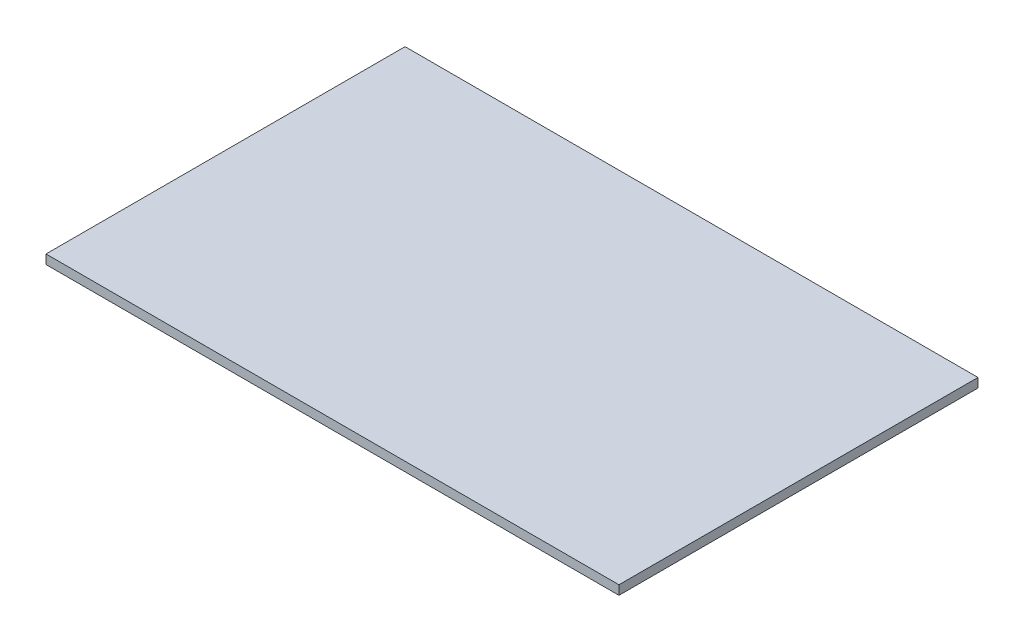
ISO-10303-21;
HEADER;
FILE_DESCRIPTION(('STEP AP214'),'2;1');
FILE_NAME('part.step','',(''),(''),'','','');
FILE_SCHEMA(('AUTOMOTIVE_DESIGN { 1 0 10303 214 1 1 1 1 }'));
ENDSEC;
DATA;
#1=APPLICATION_CONTEXT('core data for automotive mechanical design processes');
#2=APPLICATION_PROTOCOL_DEFINITION('international standard','automotive_design',2000,#1);
#3=PRODUCT_CONTEXT('',#1,'mechanical');
#4=PRODUCT('Part','Part','',(#3));
#5=PRODUCT_RELATED_PRODUCT_CATEGORY('part','',(#4));
#6=PRODUCT_DEFINITION_FORMATION('','',#4);
#7=PRODUCT_DEFINITION_CONTEXT('part definition',#1,'design');
#8=PRODUCT_DEFINITION('design','',#6,#7);
#9=PRODUCT_DEFINITION_SHAPE('','',#8);
#10=(LENGTH_UNIT() NAMED_UNIT(*) SI_UNIT(.MILLI.,.METRE.));
#11=(NAMED_UNIT(*) PLANE_ANGLE_UNIT() SI_UNIT($,.RADIAN.));
#12=(NAMED_UNIT(*) SI_UNIT($,.STERADIAN.) SOLID_ANGLE_UNIT());
#13=UNCERTAINTY_MEASURE_WITH_UNIT(LENGTH_MEASURE(1.E-05),#10,'distance_accuracy_value','');
#14=(GEOMETRIC_REPRESENTATION_CONTEXT(3) GLOBAL_UNCERTAINTY_ASSIGNED_CONTEXT((#13)) GLOBAL_UNIT_ASSIGNED_CONTEXT((#10,
#11,#12)) REPRESENTATION_CONTEXT('',''));
#15=CARTESIAN_POINT('',(0.,0.,0.));
#16=DIRECTION('',(0.,0.,1.));
#17=DIRECTION('',(1.,0.,0.));
#18=AXIS2_PLACEMENT_3D('',#15,#16,#17);
#19=CARTESIAN_POINT('',(375.,12.,235.));
#20=DIRECTION('',(-1.,0.,0.));
#21=DIRECTION('',(0.,0.,1.));
#22=AXIS2_PLACEMENT_3D('',#19,#20,#21);
#23=PLANE('',#22);
#24=DIRECTION('',(0.,0.,-1.));
#25=VECTOR('',#24,1.);
#26=CARTESIAN_POINT('',(375.,0.,235.));
#27=LINE('',#26,#25);
#28=CARTESIAN_POINT('',(375.,0.,235.));
#29=VERTEX_POINT('',#28);
#30=CARTESIAN_POINT('',(375.,0.,-235.));
#31=VERTEX_POINT('',#30);
#32=EDGE_CURVE('E96',#29,#31,#27,.T.);
#33=ORIENTED_EDGE('',*,*,#32,.T.);
#34=DIRECTION('',(0.,-1.,0.));
#35=VECTOR('',#34,1.);
#36=CARTESIAN_POINT('',(375.,12.,-235.));
#37=LINE('',#36,#35);
#38=CARTESIAN_POINT('',(375.,12.,-235.));
#39=VERTEX_POINT('',#38);
#40=EDGE_CURVE('E11',#39,#31,#37,.T.);
#41=ORIENTED_EDGE('',*,*,#40,.F.);
#42=DIRECTION('',(0.,0.,-1.));
#43=VECTOR('',#42,1.);
#44=CARTESIAN_POINT('',(375.,12.,235.));
#45=LINE('',#44,#43);
#46=CARTESIAN_POINT('',(375.,12.,235.));
#47=VERTEX_POINT('',#46);
#48=EDGE_CURVE('E84',#47,#39,#45,.T.);
#49=ORIENTED_EDGE('',*,*,#48,.F.);
#50=DIRECTION('',(0.,-1.,0.));
#51=VECTOR('',#50,1.);
#52=CARTESIAN_POINT('',(375.,12.,235.));
#53=LINE('',#52,#51);
#54=EDGE_CURVE('E92',#47,#29,#53,.T.);
#55=ORIENTED_EDGE('',*,*,#54,.T.);
#56=EDGE_LOOP('',(#33,#41,#49,#55));
#57=FACE_BOUND('',#56,.T.);
#58=ADVANCED_FACE('F33',(#57),#23,.F.);
#59=CARTESIAN_POINT('',(-375.,12.,-235.));
#60=DIRECTION('',(0.,0.,1.));
#61=DIRECTION('',(1.,0.,0.));
#62=AXIS2_PLACEMENT_3D('',#59,#60,#61);
#63=PLANE('',#62);
#64=DIRECTION('',(-1.,0.,0.));
#65=VECTOR('',#64,1.);
#66=CARTESIAN_POINT('',(-375.,0.,-235.));
#67=LINE('',#66,#65);
#68=CARTESIAN_POINT('',(-375.,0.,-235.));
#69=VERTEX_POINT('',#68);
#70=EDGE_CURVE('E88',#31,#69,#67,.T.);
#71=ORIENTED_EDGE('',*,*,#70,.T.);
#72=DIRECTION('',(0.,-1.,0.));
#73=VECTOR('',#72,1.);
#74=CARTESIAN_POINT('',(-375.,12.,-235.));
#75=LINE('',#74,#73);
#76=CARTESIAN_POINT('',(-375.,12.,-235.));
#77=VERTEX_POINT('',#76);
#78=EDGE_CURVE('E41',#77,#69,#75,.T.);
#79=ORIENTED_EDGE('',*,*,#78,.F.);
#80=DIRECTION('',(-1.,0.,0.));
#81=VECTOR('',#80,1.);
#82=CARTESIAN_POINT('',(-375.,12.,-235.));
#83=LINE('',#82,#81);
#84=EDGE_CURVE('E79',#39,#77,#83,.T.);
#85=ORIENTED_EDGE('',*,*,#84,.F.);
#86=ORIENTED_EDGE('',*,*,#40,.T.);
#87=EDGE_LOOP('',(#71,#79,#85,#86));
#88=FACE_BOUND('',#87,.T.);
#89=ADVANCED_FACE('F87',(#88),#63,.F.);
#90=CARTESIAN_POINT('',(-375.,12.,235.));
#91=DIRECTION('',(1.,0.,0.));
#92=DIRECTION('',(0.,0.,-1.));
#93=AXIS2_PLACEMENT_3D('',#90,#91,#92);
#94=PLANE('',#93);
#95=DIRECTION('',(0.,0.,1.));
#96=VECTOR('',#95,1.);
#97=CARTESIAN_POINT('',(-375.,0.,235.));
#98=LINE('',#97,#96);
#99=CARTESIAN_POINT('',(-375.,0.,235.));
#100=VERTEX_POINT('',#99);
#101=EDGE_CURVE('E66',#69,#100,#98,.T.);
#102=ORIENTED_EDGE('',*,*,#101,.T.);
#103=DIRECTION('',(0.,-1.,0.));
#104=VECTOR('',#103,1.);
#105=CARTESIAN_POINT('',(-375.,12.,235.));
#106=LINE('',#105,#104);
#107=CARTESIAN_POINT('',(-375.,12.,235.));
#108=VERTEX_POINT('',#107);
#109=EDGE_CURVE('E89',#108,#100,#106,.T.);
#110=ORIENTED_EDGE('',*,*,#109,.F.);
#111=DIRECTION('',(0.,0.,1.));
#112=VECTOR('',#111,1.);
#113=CARTESIAN_POINT('',(-375.,12.,235.));
#114=LINE('',#113,#112);
#115=EDGE_CURVE('E82',#77,#108,#114,.T.);
#116=ORIENTED_EDGE('',*,*,#115,.F.);
#117=ORIENTED_EDGE('',*,*,#78,.T.);
#118=EDGE_LOOP('',(#102,#110,#116,#117));
#119=FACE_BOUND('',#118,.T.);
#120=ADVANCED_FACE('F90',(#119),#94,.F.);
#121=CARTESIAN_POINT('',(-375.,12.,235.));
#122=DIRECTION('',(0.,0.,-1.));
#123=DIRECTION('',(-1.,0.,0.));
#124=AXIS2_PLACEMENT_3D('',#121,#122,#123);
#125=PLANE('',#124);
#126=DIRECTION('',(1.,0.,0.));
#127=VECTOR('',#126,1.);
#128=CARTESIAN_POINT('',(-375.,0.,235.));
#129=LINE('',#128,#127);
#130=EDGE_CURVE('E72',#100,#29,#129,.T.);
#131=ORIENTED_EDGE('',*,*,#130,.T.);
#132=ORIENTED_EDGE('',*,*,#54,.F.);
#133=DIRECTION('',(1.,0.,0.));
#134=VECTOR('',#133,1.);
#135=CARTESIAN_POINT('',(-375.,12.,235.));
#136=LINE('',#135,#134);
#137=EDGE_CURVE('E49',#108,#47,#136,.T.);
#138=ORIENTED_EDGE('',*,*,#137,.F.);
#139=ORIENTED_EDGE('',*,*,#109,.T.);
#140=EDGE_LOOP('',(#131,#132,#138,#139));
#141=FACE_BOUND('',#140,.T.);
#142=ADVANCED_FACE('F103',(#141),#125,.F.);
#143=CARTESIAN_POINT('',(0.,12.,0.));
#144=DIRECTION('',(0.,-1.,0.));
#145=DIRECTION('',(0.,0.,-1.));
#146=AXIS2_PLACEMENT_3D('',#143,#144,#145);
#147=PLANE('',#146);
#148=ORIENTED_EDGE('',*,*,#48,.T.);
#149=ORIENTED_EDGE('',*,*,#84,.T.);
#150=ORIENTED_EDGE('',*,*,#115,.T.);
#151=ORIENTED_EDGE('',*,*,#137,.T.);
#152=EDGE_LOOP('',(#148,#149,#150,#151));
#153=FACE_BOUND('',#152,.T.);
#154=ADVANCED_FACE('F80',(#153),#147,.F.);
#155=CARTESIAN_POINT('',(0.,0.,0.));
#156=DIRECTION('',(0.,-1.,0.));
#157=DIRECTION('',(0.,0.,-1.));
#158=AXIS2_PLACEMENT_3D('',#155,#156,#157);
#159=PLANE('',#158);
#160=ORIENTED_EDGE('',*,*,#32,.F.);
#161=ORIENTED_EDGE('',*,*,#130,.F.);
#162=ORIENTED_EDGE('',*,*,#101,.F.);
#163=ORIENTED_EDGE('',*,*,#70,.F.);
#164=EDGE_LOOP('',(#160,#161,#162,#163));
#165=FACE_BOUND('',#164,.T.);
#166=ADVANCED_FACE('F106',(#165),#159,.T.);
#167=CLOSED_SHELL('',(#58,#89,#120,#142,#154,#166));
#168=MANIFOLD_SOLID_BREP('B2',#167);
#169=ADVANCED_BREP_SHAPE_REPRESENTATION('',(#18,#168),#14);
#170=SHAPE_DEFINITION_REPRESENTATION(#9,#169);
ENDSEC;
END-ISO-10303-21;
